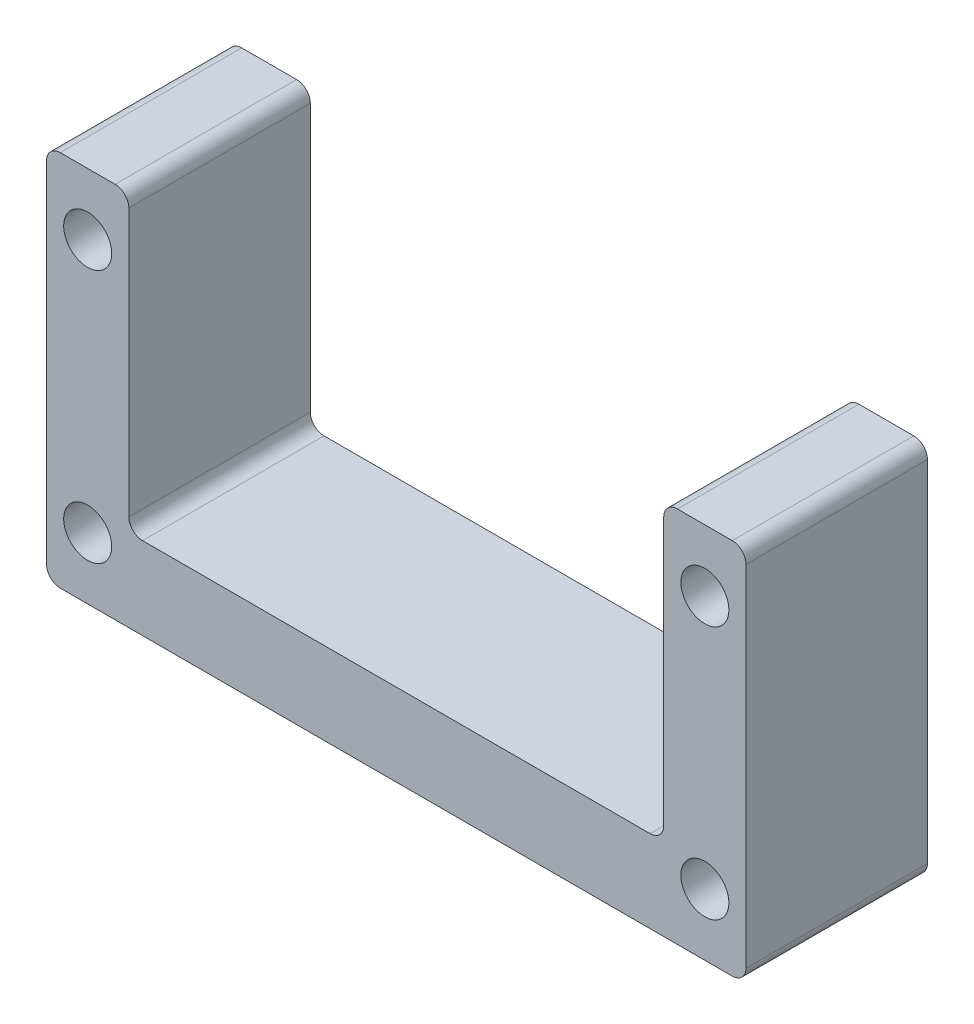
ISO-10303-21;
HEADER;
FILE_DESCRIPTION(('STEP AP214'),'2;1');
FILE_NAME('part.step','',(''),(''),'','','');
FILE_SCHEMA(('AUTOMOTIVE_DESIGN { 1 0 10303 214 1 1 1 1 }'));
ENDSEC;
DATA;
#1=APPLICATION_CONTEXT('core data for automotive mechanical design processes');
#2=APPLICATION_PROTOCOL_DEFINITION('international standard','automotive_design',2000,#1);
#3=PRODUCT_CONTEXT('',#1,'mechanical');
#4=PRODUCT('Part','Part','',(#3));
#5=PRODUCT_RELATED_PRODUCT_CATEGORY('part','',(#4));
#6=PRODUCT_DEFINITION_FORMATION('','',#4);
#7=PRODUCT_DEFINITION_CONTEXT('part definition',#1,'design');
#8=PRODUCT_DEFINITION('design','',#6,#7);
#9=PRODUCT_DEFINITION_SHAPE('','',#8);
#10=(LENGTH_UNIT() NAMED_UNIT(*) SI_UNIT(.MILLI.,.METRE.));
#11=(NAMED_UNIT(*) PLANE_ANGLE_UNIT() SI_UNIT($,.RADIAN.));
#12=(NAMED_UNIT(*) SI_UNIT($,.STERADIAN.) SOLID_ANGLE_UNIT());
#13=UNCERTAINTY_MEASURE_WITH_UNIT(LENGTH_MEASURE(1.E-05),#10,'distance_accuracy_value','');
#14=(GEOMETRIC_REPRESENTATION_CONTEXT(3) GLOBAL_UNCERTAINTY_ASSIGNED_CONTEXT((#13)) GLOBAL_UNIT_ASSIGNED_CONTEXT((#10,
#11,#12)) REPRESENTATION_CONTEXT('',''));
#15=CARTESIAN_POINT('',(0.,0.,0.));
#16=DIRECTION('',(0.,0.,1.));
#17=DIRECTION('',(1.,0.,0.));
#18=AXIS2_PLACEMENT_3D('',#15,#16,#17);
#19=CARTESIAN_POINT('',(25.5,13.75,13.23));
#20=DIRECTION('',(-1.,0.,0.));
#21=DIRECTION('',(0.,-1.,0.));
#22=AXIS2_PLACEMENT_3D('',#19,#20,#21);
#23=PLANE('',#22);
#24=DIRECTION('',(0.,1.,0.));
#25=VECTOR('',#24,1.);
#26=CARTESIAN_POINT('',(25.5,13.75,13.23));
#27=LINE('',#26,#25);
#28=CARTESIAN_POINT('',(25.5,-12.75,13.23));
#29=VERTEX_POINT('',#28);
#30=CARTESIAN_POINT('',(25.5,12.75,13.23));
#31=VERTEX_POINT('',#30);
#32=EDGE_CURVE('E172',#29,#31,#27,.T.);
#33=ORIENTED_EDGE('',*,*,#32,.F.);
#34=DIRECTION('',(0.,0.,-1.));
#35=VECTOR('',#34,1.);
#36=CARTESIAN_POINT('',(25.5,-12.75,13.23));
#37=LINE('',#36,#35);
#38=CARTESIAN_POINT('',(25.5,-12.75,0.));
#39=VERTEX_POINT('',#38);
#40=EDGE_CURVE('E157',#29,#39,#37,.T.);
#41=ORIENTED_EDGE('',*,*,#40,.T.);
#42=DIRECTION('',(0.,1.,0.));
#43=VECTOR('',#42,1.);
#44=CARTESIAN_POINT('',(25.5,13.75,0.));
#45=LINE('',#44,#43);
#46=CARTESIAN_POINT('',(25.5,12.75,0.));
#47=VERTEX_POINT('',#46);
#48=EDGE_CURVE('E169',#39,#47,#45,.T.);
#49=ORIENTED_EDGE('',*,*,#48,.T.);
#50=DIRECTION('',(0.,0.,-1.));
#51=VECTOR('',#50,1.);
#52=CARTESIAN_POINT('',(25.5,12.75,13.23));
#53=LINE('',#52,#51);
#54=EDGE_CURVE('E174',#47,#31,#53,.F.);
#55=ORIENTED_EDGE('',*,*,#54,.T.);
#56=EDGE_LOOP('',(#33,#41,#49,#55));
#57=FACE_BOUND('',#56,.T.);
#58=ADVANCED_FACE('F39',(#57),#23,.F.);
#59=CARTESIAN_POINT('',(19.5,13.75,13.23));
#60=DIRECTION('',(0.,-1.,0.));
#61=DIRECTION('',(0.,0.,-1.));
#62=AXIS2_PLACEMENT_3D('',#59,#60,#61);
#63=PLANE('',#62);
#64=DIRECTION('',(-1.,0.,0.));
#65=VECTOR('',#64,1.);
#66=CARTESIAN_POINT('',(19.5,13.75,0.));
#67=LINE('',#66,#65);
#68=CARTESIAN_POINT('',(24.5,13.75,0.));
#69=VERTEX_POINT('',#68);
#70=CARTESIAN_POINT('',(20.5,13.75,0.));
#71=VERTEX_POINT('',#70);
#72=EDGE_CURVE('E178',#69,#71,#67,.T.);
#73=ORIENTED_EDGE('',*,*,#72,.T.);
#74=DIRECTION('',(0.,0.,-1.));
#75=VECTOR('',#74,1.);
#76=CARTESIAN_POINT('',(20.5,13.75,13.23));
#77=LINE('',#76,#75);
#78=CARTESIAN_POINT('',(20.5,13.75,13.23));
#79=VERTEX_POINT('',#78);
#80=EDGE_CURVE('E256',#71,#79,#77,.F.);
#81=ORIENTED_EDGE('',*,*,#80,.T.);
#82=DIRECTION('',(-1.,0.,0.));
#83=VECTOR('',#82,1.);
#84=CARTESIAN_POINT('',(19.5,13.75,13.23));
#85=LINE('',#84,#83);
#86=CARTESIAN_POINT('',(24.5,13.75,13.23));
#87=VERTEX_POINT('',#86);
#88=EDGE_CURVE('E288',#87,#79,#85,.T.);
#89=ORIENTED_EDGE('',*,*,#88,.F.);
#90=DIRECTION('',(0.,0.,-1.));
#91=VECTOR('',#90,1.);
#92=CARTESIAN_POINT('',(24.5,13.75,13.23));
#93=LINE('',#92,#91);
#94=EDGE_CURVE('E253',#87,#69,#93,.T.);
#95=ORIENTED_EDGE('',*,*,#94,.T.);
#96=EDGE_LOOP('',(#73,#81,#89,#95));
#97=FACE_BOUND('',#96,.T.);
#98=ADVANCED_FACE('F332',(#97),#63,.F.);
#99=CARTESIAN_POINT('',(19.5,-7.75,13.23));
#100=DIRECTION('',(1.,0.,0.));
#101=DIRECTION('',(0.,1.,0.));
#102=AXIS2_PLACEMENT_3D('',#99,#100,#101);
#103=PLANE('',#102);
#104=DIRECTION('',(0.,-1.,0.));
#105=VECTOR('',#104,1.);
#106=CARTESIAN_POINT('',(19.5,-7.75,0.));
#107=LINE('',#106,#105);
#108=CARTESIAN_POINT('',(19.5,12.75,0.));
#109=VERTEX_POINT('',#108);
#110=CARTESIAN_POINT('',(19.5,-6.75,0.));
#111=VERTEX_POINT('',#110);
#112=EDGE_CURVE('E182',#109,#111,#107,.T.);
#113=ORIENTED_EDGE('',*,*,#112,.T.);
#114=DIRECTION('',(0.,0.,-1.));
#115=VECTOR('',#114,1.);
#116=CARTESIAN_POINT('',(19.5,-6.75,13.23));
#117=LINE('',#116,#115);
#118=CARTESIAN_POINT('',(19.5,-6.75,13.23));
#119=VERTEX_POINT('',#118);
#120=EDGE_CURVE('E251',#111,#119,#117,.F.);
#121=ORIENTED_EDGE('',*,*,#120,.T.);
#122=DIRECTION('',(0.,-1.,0.));
#123=VECTOR('',#122,1.);
#124=CARTESIAN_POINT('',(19.5,-7.75,13.23));
#125=LINE('',#124,#123);
#126=CARTESIAN_POINT('',(19.5,12.75,13.23));
#127=VERTEX_POINT('',#126);
#128=EDGE_CURVE('E279',#127,#119,#125,.T.);
#129=ORIENTED_EDGE('',*,*,#128,.F.);
#130=DIRECTION('',(0.,0.,-1.));
#131=VECTOR('',#130,1.);
#132=CARTESIAN_POINT('',(19.5,12.75,13.23));
#133=LINE('',#132,#131);
#134=EDGE_CURVE('E248',#127,#109,#133,.T.);
#135=ORIENTED_EDGE('',*,*,#134,.T.);
#136=EDGE_LOOP('',(#113,#121,#129,#135));
#137=FACE_BOUND('',#136,.T.);
#138=ADVANCED_FACE('F267',(#137),#103,.F.);
#139=CARTESIAN_POINT('',(-19.5,-7.75,13.23));
#140=DIRECTION('',(0.,-1.,0.));
#141=DIRECTION('',(0.,0.,-1.));
#142=AXIS2_PLACEMENT_3D('',#139,#140,#141);
#143=PLANE('',#142);
#144=DIRECTION('',(-1.,0.,0.));
#145=VECTOR('',#144,1.);
#146=CARTESIAN_POINT('',(-19.5,-7.75,0.));
#147=LINE('',#146,#145);
#148=CARTESIAN_POINT('',(18.5,-7.75,0.));
#149=VERTEX_POINT('',#148);
#150=CARTESIAN_POINT('',(-18.5,-7.75,0.));
#151=VERTEX_POINT('',#150);
#152=EDGE_CURVE('E193',#149,#151,#147,.T.);
#153=ORIENTED_EDGE('',*,*,#152,.T.);
#154=DIRECTION('',(0.,0.,-1.));
#155=VECTOR('',#154,1.);
#156=CARTESIAN_POINT('',(-18.5,-7.75,13.23));
#157=LINE('',#156,#155);
#158=CARTESIAN_POINT('',(-18.5,-7.75,13.23));
#159=VERTEX_POINT('',#158);
#160=EDGE_CURVE('E246',#151,#159,#157,.F.);
#161=ORIENTED_EDGE('',*,*,#160,.T.);
#162=DIRECTION('',(-1.,0.,0.));
#163=VECTOR('',#162,1.);
#164=CARTESIAN_POINT('',(-19.5,-7.75,13.23));
#165=LINE('',#164,#163);
#166=CARTESIAN_POINT('',(18.5,-7.75,13.23));
#167=VERTEX_POINT('',#166);
#168=EDGE_CURVE('E277',#167,#159,#165,.T.);
#169=ORIENTED_EDGE('',*,*,#168,.F.);
#170=DIRECTION('',(0.,0.,-1.));
#171=VECTOR('',#170,1.);
#172=CARTESIAN_POINT('',(18.5,-7.75,0.));
#173=LINE('',#172,#171);
#174=EDGE_CURVE('E243',#167,#149,#173,.T.);
#175=ORIENTED_EDGE('',*,*,#174,.T.);
#176=EDGE_LOOP('',(#153,#161,#169,#175));
#177=FACE_BOUND('',#176,.T.);
#178=ADVANCED_FACE('F281',(#177),#143,.F.);
#179=CARTESIAN_POINT('',(-19.5,13.75,13.23));
#180=DIRECTION('',(-1.,0.,0.));
#181=DIRECTION('',(0.,0.,1.));
#182=AXIS2_PLACEMENT_3D('',#179,#180,#181);
#183=PLANE('',#182);
#184=DIRECTION('',(0.,1.,0.));
#185=VECTOR('',#184,1.);
#186=CARTESIAN_POINT('',(-19.5,13.75,0.));
#187=LINE('',#186,#185);
#188=CARTESIAN_POINT('',(-19.5,-6.75,0.));
#189=VERTEX_POINT('',#188);
#190=CARTESIAN_POINT('',(-19.5,12.75,0.));
#191=VERTEX_POINT('',#190);
#192=EDGE_CURVE('E196',#189,#191,#187,.T.);
#193=ORIENTED_EDGE('',*,*,#192,.T.);
#194=DIRECTION('',(0.,0.,-1.));
#195=VECTOR('',#194,1.);
#196=CARTESIAN_POINT('',(-19.5,12.75,13.23));
#197=LINE('',#196,#195);
#198=CARTESIAN_POINT('',(-19.5,12.75,13.23));
#199=VERTEX_POINT('',#198);
#200=EDGE_CURVE('E241',#191,#199,#197,.F.);
#201=ORIENTED_EDGE('',*,*,#200,.T.);
#202=DIRECTION('',(0.,1.,0.));
#203=VECTOR('',#202,1.);
#204=CARTESIAN_POINT('',(-19.5,13.75,13.23));
#205=LINE('',#204,#203);
#206=CARTESIAN_POINT('',(-19.5,-6.75,13.23));
#207=VERTEX_POINT('',#206);
#208=EDGE_CURVE('E283',#207,#199,#205,.T.);
#209=ORIENTED_EDGE('',*,*,#208,.F.);
#210=DIRECTION('',(0.,0.,-1.));
#211=VECTOR('',#210,1.);
#212=CARTESIAN_POINT('',(-19.5,-6.75,0.));
#213=LINE('',#212,#211);
#214=EDGE_CURVE('E238',#207,#189,#213,.T.);
#215=ORIENTED_EDGE('',*,*,#214,.T.);
#216=EDGE_LOOP('',(#193,#201,#209,#215));
#217=FACE_BOUND('',#216,.T.);
#218=ADVANCED_FACE('F317',(#217),#183,.F.);
#219=CARTESIAN_POINT('',(-25.5,13.75,13.23));
#220=DIRECTION('',(0.,-1.,0.));
#221=DIRECTION('',(1.,0.,0.));
#222=AXIS2_PLACEMENT_3D('',#219,#220,#221);
#223=PLANE('',#222);
#224=DIRECTION('',(-1.,0.,0.));
#225=VECTOR('',#224,1.);
#226=CARTESIAN_POINT('',(-25.5,13.75,0.));
#227=LINE('',#226,#225);
#228=CARTESIAN_POINT('',(-20.5,13.75,0.));
#229=VERTEX_POINT('',#228);
#230=CARTESIAN_POINT('',(-24.5,13.75,0.));
#231=VERTEX_POINT('',#230);
#232=EDGE_CURVE('E199',#229,#231,#227,.T.);
#233=ORIENTED_EDGE('',*,*,#232,.T.);
#234=DIRECTION('',(0.,0.,-1.));
#235=VECTOR('',#234,1.);
#236=CARTESIAN_POINT('',(-24.5,13.75,13.23));
#237=LINE('',#236,#235);
#238=CARTESIAN_POINT('',(-24.5,13.75,13.23));
#239=VERTEX_POINT('',#238);
#240=EDGE_CURVE('E236',#231,#239,#237,.F.);
#241=ORIENTED_EDGE('',*,*,#240,.T.);
#242=DIRECTION('',(-1.,0.,0.));
#243=VECTOR('',#242,1.);
#244=CARTESIAN_POINT('',(-25.5,13.75,13.23));
#245=LINE('',#244,#243);
#246=CARTESIAN_POINT('',(-20.5,13.75,13.23));
#247=VERTEX_POINT('',#246);
#248=EDGE_CURVE('E286',#247,#239,#245,.T.);
#249=ORIENTED_EDGE('',*,*,#248,.F.);
#250=DIRECTION('',(0.,0.,-1.));
#251=VECTOR('',#250,1.);
#252=CARTESIAN_POINT('',(-20.5,13.75,13.23));
#253=LINE('',#252,#251);
#254=EDGE_CURVE('E233',#247,#229,#253,.T.);
#255=ORIENTED_EDGE('',*,*,#254,.T.);
#256=EDGE_LOOP('',(#233,#241,#249,#255));
#257=FACE_BOUND('',#256,.T.);
#258=ADVANCED_FACE('F308',(#257),#223,.F.);
#259=CARTESIAN_POINT('',(-25.5,13.75,13.23));
#260=DIRECTION('',(1.,0.,0.));
#261=DIRECTION('',(0.,1.,0.));
#262=AXIS2_PLACEMENT_3D('',#259,#260,#261);
#263=PLANE('',#262);
#264=DIRECTION('',(0.,-1.,0.));
#265=VECTOR('',#264,1.);
#266=CARTESIAN_POINT('',(-25.5,13.75,0.));
#267=LINE('',#266,#265);
#268=CARTESIAN_POINT('',(-25.5,12.75,0.));
#269=VERTEX_POINT('',#268);
#270=CARTESIAN_POINT('',(-25.5,-12.75,0.));
#271=VERTEX_POINT('',#270);
#272=EDGE_CURVE('E202',#269,#271,#267,.T.);
#273=ORIENTED_EDGE('',*,*,#272,.T.);
#274=DIRECTION('',(0.,0.,-1.));
#275=VECTOR('',#274,1.);
#276=CARTESIAN_POINT('',(-25.5,-12.75,13.23));
#277=LINE('',#276,#275);
#278=CARTESIAN_POINT('',(-25.5,-12.75,13.23));
#279=VERTEX_POINT('',#278);
#280=EDGE_CURVE('E54',#271,#279,#277,.F.);
#281=ORIENTED_EDGE('',*,*,#280,.T.);
#282=DIRECTION('',(0.,-1.,0.));
#283=VECTOR('',#282,1.);
#284=CARTESIAN_POINT('',(-25.5,13.75,13.23));
#285=LINE('',#284,#283);
#286=CARTESIAN_POINT('',(-25.5,12.75,13.23));
#287=VERTEX_POINT('',#286);
#288=EDGE_CURVE('E292',#287,#279,#285,.T.);
#289=ORIENTED_EDGE('',*,*,#288,.F.);
#290=DIRECTION('',(0.,0.,-1.));
#291=VECTOR('',#290,1.);
#292=CARTESIAN_POINT('',(-25.5,12.75,13.23));
#293=LINE('',#292,#291);
#294=EDGE_CURVE('E229',#287,#269,#293,.T.);
#295=ORIENTED_EDGE('',*,*,#294,.T.);
#296=EDGE_LOOP('',(#273,#281,#289,#295));
#297=FACE_BOUND('',#296,.T.);
#298=ADVANCED_FACE('F301',(#297),#263,.F.);
#299=CARTESIAN_POINT('',(-25.5,-13.75,13.23));
#300=DIRECTION('',(0.,1.,0.));
#301=DIRECTION('',(0.,0.,1.));
#302=AXIS2_PLACEMENT_3D('',#299,#300,#301);
#303=PLANE('',#302);
#304=DIRECTION('',(1.,0.,0.));
#305=VECTOR('',#304,1.);
#306=CARTESIAN_POINT('',(-25.5,-13.75,0.));
#307=LINE('',#306,#305);
#308=CARTESIAN_POINT('',(-24.5,-13.75,0.));
#309=VERTEX_POINT('',#308);
#310=CARTESIAN_POINT('',(24.5,-13.75,0.));
#311=VERTEX_POINT('',#310);
#312=EDGE_CURVE('E204',#309,#311,#307,.T.);
#313=ORIENTED_EDGE('',*,*,#312,.T.);
#314=DIRECTION('',(0.,0.,-1.));
#315=VECTOR('',#314,1.);
#316=CARTESIAN_POINT('',(24.5,-13.75,13.23));
#317=LINE('',#316,#315);
#318=CARTESIAN_POINT('',(24.5,-13.75,13.23));
#319=VERTEX_POINT('',#318);
#320=EDGE_CURVE('E158',#311,#319,#317,.F.);
#321=ORIENTED_EDGE('',*,*,#320,.T.);
#322=DIRECTION('',(1.,0.,0.));
#323=VECTOR('',#322,1.);
#324=CARTESIAN_POINT('',(-25.5,-13.75,13.23));
#325=LINE('',#324,#323);
#326=CARTESIAN_POINT('',(-24.5,-13.75,13.23));
#327=VERTEX_POINT('',#326);
#328=EDGE_CURVE('E188',#327,#319,#325,.T.);
#329=ORIENTED_EDGE('',*,*,#328,.F.);
#330=DIRECTION('',(0.,0.,-1.));
#331=VECTOR('',#330,1.);
#332=CARTESIAN_POINT('',(-24.5,-13.75,13.23));
#333=LINE('',#332,#331);
#334=EDGE_CURVE('E163',#327,#309,#333,.T.);
#335=ORIENTED_EDGE('',*,*,#334,.T.);
#336=EDGE_LOOP('',(#313,#321,#329,#335));
#337=FACE_BOUND('',#336,.T.);
#338=ADVANCED_FACE('F297',(#337),#303,.F.);
#339=CARTESIAN_POINT('',(0.,0.,13.23));
#340=DIRECTION('',(0.,0.,1.));
#341=DIRECTION('',(1.,0.,0.));
#342=AXIS2_PLACEMENT_3D('',#339,#340,#341);
#343=PLANE('',#342);
#344=CARTESIAN_POINT('',(22.5,9.25,13.23));
#345=DIRECTION('',(0.,0.,1.));
#346=DIRECTION('',(1.,0.,0.));
#347=AXIS2_PLACEMENT_3D('',#344,#345,#346);
#348=CIRCLE('',#347,1.75);
#349=CARTESIAN_POINT('',(24.25,9.25,13.23));
#350=VERTEX_POINT('',#349);
#351=EDGE_CURVE('E558',#350,#350,#348,.T.);
#352=ORIENTED_EDGE('',*,*,#351,.F.);
#353=EDGE_LOOP('',(#352));
#354=FACE_BOUND('',#353,.T.);
#355=CARTESIAN_POINT('',(22.5,-9.25,13.23));
#356=DIRECTION('',(0.,0.,1.));
#357=DIRECTION('',(1.,0.,0.));
#358=AXIS2_PLACEMENT_3D('',#355,#356,#357);
#359=CIRCLE('',#358,1.75);
#360=CARTESIAN_POINT('',(24.25,-9.25,13.23));
#361=VERTEX_POINT('',#360);
#362=EDGE_CURVE('E562',#361,#361,#359,.T.);
#363=ORIENTED_EDGE('',*,*,#362,.F.);
#364=EDGE_LOOP('',(#363));
#365=FACE_BOUND('',#364,.T.);
#366=CARTESIAN_POINT('',(-22.5,-9.25,13.23));
#367=DIRECTION('',(0.,0.,1.));
#368=DIRECTION('',(1.,0.,0.));
#369=AXIS2_PLACEMENT_3D('',#366,#367,#368);
#370=CIRCLE('',#369,1.75);
#371=CARTESIAN_POINT('',(-20.75,-9.25,13.23));
#372=VERTEX_POINT('',#371);
#373=EDGE_CURVE('E566',#372,#372,#370,.T.);
#374=ORIENTED_EDGE('',*,*,#373,.F.);
#375=EDGE_LOOP('',(#374));
#376=FACE_BOUND('',#375,.T.);
#377=CARTESIAN_POINT('',(-22.5,9.25,13.23));
#378=DIRECTION('',(0.,0.,1.));
#379=DIRECTION('',(1.,0.,0.));
#380=AXIS2_PLACEMENT_3D('',#377,#378,#379);
#381=CIRCLE('',#380,1.75);
#382=CARTESIAN_POINT('',(-20.75,9.25,13.23));
#383=VERTEX_POINT('',#382);
#384=EDGE_CURVE('E185',#383,#383,#381,.T.);
#385=ORIENTED_EDGE('',*,*,#384,.F.);
#386=EDGE_LOOP('',(#385));
#387=FACE_BOUND('',#386,.T.);
#388=ORIENTED_EDGE('',*,*,#328,.T.);
#389=CARTESIAN_POINT('',(24.5,-12.75,13.23));
#390=DIRECTION('',(0.,0.,1.));
#391=DIRECTION('',(1.,0.,0.));
#392=AXIS2_PLACEMENT_3D('',#389,#390,#391);
#393=CIRCLE('',#392,1.);
#394=EDGE_CURVE('E227',#319,#29,#393,.T.);
#395=ORIENTED_EDGE('',*,*,#394,.T.);
#396=ORIENTED_EDGE('',*,*,#32,.T.);
#397=CARTESIAN_POINT('',(24.5,12.75,13.23));
#398=DIRECTION('',(0.,0.,1.));
#399=DIRECTION('',(1.,0.,0.));
#400=AXIS2_PLACEMENT_3D('',#397,#398,#399);
#401=CIRCLE('',#400,1.);
#402=EDGE_CURVE('E218',#31,#87,#401,.T.);
#403=ORIENTED_EDGE('',*,*,#402,.T.);
#404=ORIENTED_EDGE('',*,*,#88,.T.);
#405=CARTESIAN_POINT('',(20.5,12.75,13.23));
#406=DIRECTION('',(0.,0.,1.));
#407=DIRECTION('',(1.,0.,0.));
#408=AXIS2_PLACEMENT_3D('',#405,#406,#407);
#409=CIRCLE('',#408,1.);
#410=EDGE_CURVE('E220',#79,#127,#409,.T.);
#411=ORIENTED_EDGE('',*,*,#410,.T.);
#412=ORIENTED_EDGE('',*,*,#128,.T.);
#413=CARTESIAN_POINT('',(18.5,-6.75,13.23));
#414=DIRECTION('',(0.,0.,1.));
#415=DIRECTION('',(1.,0.,0.));
#416=AXIS2_PLACEMENT_3D('',#413,#414,#415);
#417=CIRCLE('',#416,1.);
#418=EDGE_CURVE('E11',#119,#167,#417,.F.);
#419=ORIENTED_EDGE('',*,*,#418,.T.);
#420=ORIENTED_EDGE('',*,*,#168,.T.);
#421=CARTESIAN_POINT('',(-18.5,-6.75,13.23));
#422=DIRECTION('',(0.,0.,1.));
#423=DIRECTION('',(1.,0.,0.));
#424=AXIS2_PLACEMENT_3D('',#421,#422,#423);
#425=CIRCLE('',#424,1.);
#426=EDGE_CURVE('E260',#159,#207,#425,.F.);
#427=ORIENTED_EDGE('',*,*,#426,.T.);
#428=ORIENTED_EDGE('',*,*,#208,.T.);
#429=CARTESIAN_POINT('',(-20.5,12.75,13.23));
#430=DIRECTION('',(0.,0.,1.));
#431=DIRECTION('',(1.,0.,0.));
#432=AXIS2_PLACEMENT_3D('',#429,#430,#431);
#433=CIRCLE('',#432,1.);
#434=EDGE_CURVE('E222',#199,#247,#433,.T.);
#435=ORIENTED_EDGE('',*,*,#434,.T.);
#436=ORIENTED_EDGE('',*,*,#248,.T.);
#437=CARTESIAN_POINT('',(-24.5,12.75,13.23));
#438=DIRECTION('',(0.,0.,1.));
#439=DIRECTION('',(1.,0.,0.));
#440=AXIS2_PLACEMENT_3D('',#437,#438,#439);
#441=CIRCLE('',#440,1.);
#442=EDGE_CURVE('E61',#239,#287,#441,.T.);
#443=ORIENTED_EDGE('',*,*,#442,.T.);
#444=ORIENTED_EDGE('',*,*,#288,.T.);
#445=CARTESIAN_POINT('',(-24.5,-12.75,13.23));
#446=DIRECTION('',(0.,0.,1.));
#447=DIRECTION('',(1.,0.,0.));
#448=AXIS2_PLACEMENT_3D('',#445,#446,#447);
#449=CIRCLE('',#448,1.);
#450=EDGE_CURVE('E225',#279,#327,#449,.T.);
#451=ORIENTED_EDGE('',*,*,#450,.T.);
#452=EDGE_LOOP('',(#388,#395,#396,#403,#404,#411,#412,#419,#420,#427,#428,#435,#436,#443,#444,#451));
#453=FACE_BOUND('',#452,.T.);
#454=ADVANCED_FACE('F276',(#354,#365,#376,#387,#453),#343,.T.);
#455=CARTESIAN_POINT('',(0.,0.,0.));
#456=DIRECTION('',(0.,0.,1.));
#457=DIRECTION('',(1.,0.,0.));
#458=AXIS2_PLACEMENT_3D('',#455,#456,#457);
#459=PLANE('',#458);
#460=CARTESIAN_POINT('',(22.5,9.25,0.));
#461=DIRECTION('',(0.,0.,1.));
#462=DIRECTION('',(1.,0.,0.));
#463=AXIS2_PLACEMENT_3D('',#460,#461,#462);
#464=CIRCLE('',#463,1.75);
#465=CARTESIAN_POINT('',(24.25,9.25,0.));
#466=VERTEX_POINT('',#465);
#467=EDGE_CURVE('E581',#466,#466,#464,.T.);
#468=ORIENTED_EDGE('',*,*,#467,.T.);
#469=EDGE_LOOP('',(#468));
#470=FACE_BOUND('',#469,.T.);
#471=CARTESIAN_POINT('',(22.5,-9.25,0.));
#472=DIRECTION('',(0.,0.,1.));
#473=DIRECTION('',(1.,0.,0.));
#474=AXIS2_PLACEMENT_3D('',#471,#472,#473);
#475=CIRCLE('',#474,1.75);
#476=CARTESIAN_POINT('',(24.25,-9.25,0.));
#477=VERTEX_POINT('',#476);
#478=EDGE_CURVE('E585',#477,#477,#475,.T.);
#479=ORIENTED_EDGE('',*,*,#478,.T.);
#480=EDGE_LOOP('',(#479));
#481=FACE_BOUND('',#480,.T.);
#482=CARTESIAN_POINT('',(-22.5,-9.25,0.));
#483=DIRECTION('',(0.,0.,1.));
#484=DIRECTION('',(1.,0.,0.));
#485=AXIS2_PLACEMENT_3D('',#482,#483,#484);
#486=CIRCLE('',#485,1.75);
#487=CARTESIAN_POINT('',(-20.75,-9.25,0.));
#488=VERTEX_POINT('',#487);
#489=EDGE_CURVE('E571',#488,#488,#486,.T.);
#490=ORIENTED_EDGE('',*,*,#489,.T.);
#491=EDGE_LOOP('',(#490));
#492=FACE_BOUND('',#491,.T.);
#493=CARTESIAN_POINT('',(-22.5,9.25,0.));
#494=DIRECTION('',(0.,0.,1.));
#495=DIRECTION('',(1.,0.,0.));
#496=AXIS2_PLACEMENT_3D('',#493,#494,#495);
#497=CIRCLE('',#496,1.75);
#498=CARTESIAN_POINT('',(-20.75,9.25,0.));
#499=VERTEX_POINT('',#498);
#500=EDGE_CURVE('E179',#499,#499,#497,.T.);
#501=ORIENTED_EDGE('',*,*,#500,.T.);
#502=EDGE_LOOP('',(#501));
#503=FACE_BOUND('',#502,.T.);
#504=ORIENTED_EDGE('',*,*,#48,.F.);
#505=CARTESIAN_POINT('',(24.5,-12.75,0.));
#506=DIRECTION('',(0.,0.,1.));
#507=DIRECTION('',(1.,0.,0.));
#508=AXIS2_PLACEMENT_3D('',#505,#506,#507);
#509=CIRCLE('',#508,1.);
#510=EDGE_CURVE('E153',#39,#311,#509,.F.);
#511=ORIENTED_EDGE('',*,*,#510,.T.);
#512=ORIENTED_EDGE('',*,*,#312,.F.);
#513=CARTESIAN_POINT('',(-24.5,-12.75,0.));
#514=DIRECTION('',(0.,0.,1.));
#515=DIRECTION('',(1.,0.,0.));
#516=AXIS2_PLACEMENT_3D('',#513,#514,#515);
#517=CIRCLE('',#516,1.);
#518=EDGE_CURVE('E164',#309,#271,#517,.F.);
#519=ORIENTED_EDGE('',*,*,#518,.T.);
#520=ORIENTED_EDGE('',*,*,#272,.F.);
#521=CARTESIAN_POINT('',(-24.5,12.75,0.));
#522=DIRECTION('',(0.,0.,1.));
#523=DIRECTION('',(1.,0.,0.));
#524=AXIS2_PLACEMENT_3D('',#521,#522,#523);
#525=CIRCLE('',#524,1.);
#526=EDGE_CURVE('E212',#269,#231,#525,.F.);
#527=ORIENTED_EDGE('',*,*,#526,.T.);
#528=ORIENTED_EDGE('',*,*,#232,.F.);
#529=CARTESIAN_POINT('',(-20.5,12.75,0.));
#530=DIRECTION('',(0.,0.,1.));
#531=DIRECTION('',(1.,0.,0.));
#532=AXIS2_PLACEMENT_3D('',#529,#530,#531);
#533=CIRCLE('',#532,1.);
#534=EDGE_CURVE('E210',#229,#191,#533,.F.);
#535=ORIENTED_EDGE('',*,*,#534,.T.);
#536=ORIENTED_EDGE('',*,*,#192,.F.);
#537=CARTESIAN_POINT('',(-18.5,-6.75,0.));
#538=DIRECTION('',(0.,0.,1.));
#539=DIRECTION('',(1.,0.,0.));
#540=AXIS2_PLACEMENT_3D('',#537,#538,#539);
#541=CIRCLE('',#540,1.);
#542=EDGE_CURVE('E258',#189,#151,#541,.T.);
#543=ORIENTED_EDGE('',*,*,#542,.T.);
#544=ORIENTED_EDGE('',*,*,#152,.F.);
#545=CARTESIAN_POINT('',(18.5,-6.75,0.));
#546=DIRECTION('',(0.,0.,1.));
#547=DIRECTION('',(1.,0.,0.));
#548=AXIS2_PLACEMENT_3D('',#545,#546,#547);
#549=CIRCLE('',#548,1.);
#550=EDGE_CURVE('E47',#149,#111,#549,.T.);
#551=ORIENTED_EDGE('',*,*,#550,.T.);
#552=ORIENTED_EDGE('',*,*,#112,.F.);
#553=CARTESIAN_POINT('',(20.5,12.75,0.));
#554=DIRECTION('',(0.,0.,1.));
#555=DIRECTION('',(1.,0.,0.));
#556=AXIS2_PLACEMENT_3D('',#553,#554,#555);
#557=CIRCLE('',#556,1.);
#558=EDGE_CURVE('E208',#109,#71,#557,.F.);
#559=ORIENTED_EDGE('',*,*,#558,.T.);
#560=ORIENTED_EDGE('',*,*,#72,.F.);
#561=CARTESIAN_POINT('',(24.5,12.75,0.));
#562=DIRECTION('',(0.,0.,1.));
#563=DIRECTION('',(1.,0.,0.));
#564=AXIS2_PLACEMENT_3D('',#561,#562,#563);
#565=CIRCLE('',#564,1.);
#566=EDGE_CURVE('E173',#69,#47,#565,.F.);
#567=ORIENTED_EDGE('',*,*,#566,.T.);
#568=EDGE_LOOP('',(#504,#511,#512,#519,#520,#527,#528,#535,#536,#543,#544,#551,#552,#559,#560,#567));
#569=FACE_BOUND('',#568,.T.);
#570=ADVANCED_FACE('F176',(#470,#481,#492,#503,#569),#459,.F.);
#571=CARTESIAN_POINT('',(-22.5,9.25,0.));
#572=DIRECTION('',(0.,0.,1.));
#573=DIRECTION('',(1.,0.,0.));
#574=AXIS2_PLACEMENT_3D('',#571,#572,#573);
#575=CYLINDRICAL_SURFACE('',#574,1.75);
#576=ORIENTED_EDGE('',*,*,#500,.F.);
#577=EDGE_LOOP('',(#576));
#578=FACE_BOUND('',#577,.T.);
#579=ORIENTED_EDGE('',*,*,#384,.T.);
#580=EDGE_LOOP('',(#579));
#581=FACE_BOUND('',#580,.T.);
#582=ADVANCED_FACE('F435',(#578,#581),#575,.F.);
#583=CARTESIAN_POINT('',(-22.5,-9.25,0.));
#584=DIRECTION('',(0.,0.,1.));
#585=DIRECTION('',(1.,0.,0.));
#586=AXIS2_PLACEMENT_3D('',#583,#584,#585);
#587=CYLINDRICAL_SURFACE('',#586,1.75);
#588=ORIENTED_EDGE('',*,*,#489,.F.);
#589=EDGE_LOOP('',(#588));
#590=FACE_BOUND('',#589,.T.);
#591=ORIENTED_EDGE('',*,*,#373,.T.);
#592=EDGE_LOOP('',(#591));
#593=FACE_BOUND('',#592,.T.);
#594=ADVANCED_FACE('F425',(#590,#593),#587,.F.);
#595=CARTESIAN_POINT('',(22.5,-9.25,0.));
#596=DIRECTION('',(0.,0.,1.));
#597=DIRECTION('',(1.,0.,0.));
#598=AXIS2_PLACEMENT_3D('',#595,#596,#597);
#599=CYLINDRICAL_SURFACE('',#598,1.75);
#600=ORIENTED_EDGE('',*,*,#478,.F.);
#601=EDGE_LOOP('',(#600));
#602=FACE_BOUND('',#601,.T.);
#603=ORIENTED_EDGE('',*,*,#362,.T.);
#604=EDGE_LOOP('',(#603));
#605=FACE_BOUND('',#604,.T.);
#606=ADVANCED_FACE('F415',(#602,#605),#599,.F.);
#607=CARTESIAN_POINT('',(22.5,9.25,0.));
#608=DIRECTION('',(0.,0.,1.));
#609=DIRECTION('',(1.,0.,0.));
#610=AXIS2_PLACEMENT_3D('',#607,#608,#609);
#611=CYLINDRICAL_SURFACE('',#610,1.75);
#612=ORIENTED_EDGE('',*,*,#467,.F.);
#613=EDGE_LOOP('',(#612));
#614=FACE_BOUND('',#613,.T.);
#615=ORIENTED_EDGE('',*,*,#351,.T.);
#616=EDGE_LOOP('',(#615));
#617=FACE_BOUND('',#616,.T.);
#618=ADVANCED_FACE('F343',(#614,#617),#611,.F.);
#619=CARTESIAN_POINT('',(24.5,-12.75,13.23));
#620=DIRECTION('',(0.,0.,-1.));
#621=DIRECTION('',(-1.,0.,0.));
#622=AXIS2_PLACEMENT_3D('',#619,#620,#621);
#623=CYLINDRICAL_SURFACE('',#622,1.);
#624=ORIENTED_EDGE('',*,*,#394,.F.);
#625=ORIENTED_EDGE('',*,*,#320,.F.);
#626=ORIENTED_EDGE('',*,*,#510,.F.);
#627=ORIENTED_EDGE('',*,*,#40,.F.);
#628=EDGE_LOOP('',(#624,#625,#626,#627));
#629=FACE_BOUND('',#628,.T.);
#630=ADVANCED_FACE('F156',(#629),#623,.T.);
#631=CARTESIAN_POINT('',(-24.5,-12.75,13.23));
#632=DIRECTION('',(0.,0.,-1.));
#633=DIRECTION('',(-1.,0.,0.));
#634=AXIS2_PLACEMENT_3D('',#631,#632,#633);
#635=CYLINDRICAL_SURFACE('',#634,1.);
#636=ORIENTED_EDGE('',*,*,#450,.F.);
#637=ORIENTED_EDGE('',*,*,#280,.F.);
#638=ORIENTED_EDGE('',*,*,#518,.F.);
#639=ORIENTED_EDGE('',*,*,#334,.F.);
#640=EDGE_LOOP('',(#636,#637,#638,#639));
#641=FACE_BOUND('',#640,.T.);
#642=ADVANCED_FACE('F299',(#641),#635,.T.);
#643=CARTESIAN_POINT('',(-24.5,12.75,13.23));
#644=DIRECTION('',(0.,0.,-1.));
#645=DIRECTION('',(-1.,0.,0.));
#646=AXIS2_PLACEMENT_3D('',#643,#644,#645);
#647=CYLINDRICAL_SURFACE('',#646,1.);
#648=ORIENTED_EDGE('',*,*,#442,.F.);
#649=ORIENTED_EDGE('',*,*,#240,.F.);
#650=ORIENTED_EDGE('',*,*,#526,.F.);
#651=ORIENTED_EDGE('',*,*,#294,.F.);
#652=EDGE_LOOP('',(#648,#649,#650,#651));
#653=FACE_BOUND('',#652,.T.);
#654=ADVANCED_FACE('F304',(#653),#647,.T.);
#655=CARTESIAN_POINT('',(-20.5,12.75,13.23));
#656=DIRECTION('',(0.,0.,-1.));
#657=DIRECTION('',(-1.,0.,0.));
#658=AXIS2_PLACEMENT_3D('',#655,#656,#657);
#659=CYLINDRICAL_SURFACE('',#658,1.);
#660=ORIENTED_EDGE('',*,*,#434,.F.);
#661=ORIENTED_EDGE('',*,*,#200,.F.);
#662=ORIENTED_EDGE('',*,*,#534,.F.);
#663=ORIENTED_EDGE('',*,*,#254,.F.);
#664=EDGE_LOOP('',(#660,#661,#662,#663));
#665=FACE_BOUND('',#664,.T.);
#666=ADVANCED_FACE('F313',(#665),#659,.T.);
#667=CARTESIAN_POINT('',(-18.5,-6.75,13.23));
#668=DIRECTION('',(0.,0.,1.));
#669=DIRECTION('',(1.,0.,0.));
#670=AXIS2_PLACEMENT_3D('',#667,#668,#669);
#671=CYLINDRICAL_SURFACE('',#670,1.);
#672=ORIENTED_EDGE('',*,*,#426,.F.);
#673=ORIENTED_EDGE('',*,*,#160,.F.);
#674=ORIENTED_EDGE('',*,*,#542,.F.);
#675=ORIENTED_EDGE('',*,*,#214,.F.);
#676=EDGE_LOOP('',(#672,#673,#674,#675));
#677=FACE_BOUND('',#676,.T.);
#678=ADVANCED_FACE('F321',(#677),#671,.F.);
#679=CARTESIAN_POINT('',(18.5,-6.75,13.23));
#680=DIRECTION('',(0.,0.,1.));
#681=DIRECTION('',(1.,0.,0.));
#682=AXIS2_PLACEMENT_3D('',#679,#680,#681);
#683=CYLINDRICAL_SURFACE('',#682,1.);
#684=ORIENTED_EDGE('',*,*,#418,.F.);
#685=ORIENTED_EDGE('',*,*,#120,.F.);
#686=ORIENTED_EDGE('',*,*,#550,.F.);
#687=ORIENTED_EDGE('',*,*,#174,.F.);
#688=EDGE_LOOP('',(#684,#685,#686,#687));
#689=FACE_BOUND('',#688,.T.);
#690=ADVANCED_FACE('F272',(#689),#683,.F.);
#691=CARTESIAN_POINT('',(20.5,12.75,13.23));
#692=DIRECTION('',(0.,0.,-1.));
#693=DIRECTION('',(-1.,0.,0.));
#694=AXIS2_PLACEMENT_3D('',#691,#692,#693);
#695=CYLINDRICAL_SURFACE('',#694,1.);
#696=ORIENTED_EDGE('',*,*,#410,.F.);
#697=ORIENTED_EDGE('',*,*,#80,.F.);
#698=ORIENTED_EDGE('',*,*,#558,.F.);
#699=ORIENTED_EDGE('',*,*,#134,.F.);
#700=EDGE_LOOP('',(#696,#697,#698,#699));
#701=FACE_BOUND('',#700,.T.);
#702=ADVANCED_FACE('F328',(#701),#695,.T.);
#703=CARTESIAN_POINT('',(24.5,12.75,13.23));
#704=DIRECTION('',(0.,0.,-1.));
#705=DIRECTION('',(-1.,0.,0.));
#706=AXIS2_PLACEMENT_3D('',#703,#704,#705);
#707=CYLINDRICAL_SURFACE('',#706,1.);
#708=ORIENTED_EDGE('',*,*,#402,.F.);
#709=ORIENTED_EDGE('',*,*,#54,.F.);
#710=ORIENTED_EDGE('',*,*,#566,.F.);
#711=ORIENTED_EDGE('',*,*,#94,.F.);
#712=EDGE_LOOP('',(#708,#709,#710,#711));
#713=FACE_BOUND('',#712,.T.);
#714=ADVANCED_FACE('F41',(#713),#707,.T.);
#715=CLOSED_SHELL('',(#58,#98,#138,#178,#218,#258,#298,#338,#454,#570,#582,#594,#606,#618,#630,
#642,#654,#666,#678,#690,#702,#714));
#716=MANIFOLD_SOLID_BREP('B2',#715);
#717=ADVANCED_BREP_SHAPE_REPRESENTATION('',(#18,#716),#14);
#718=SHAPE_DEFINITION_REPRESENTATION(#9,#717);
ENDSEC;
END-ISO-10303-21;
